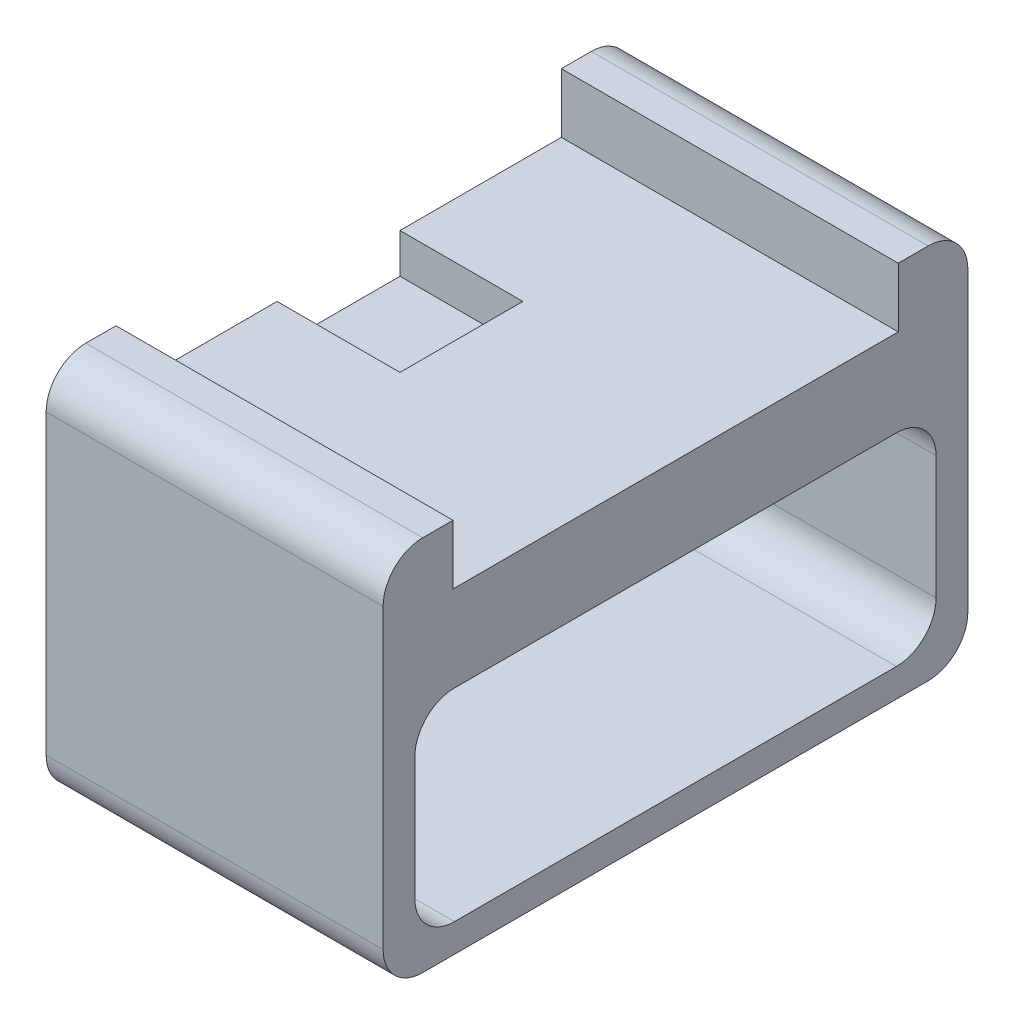
ISO-10303-21;
HEADER;
FILE_DESCRIPTION(('STEP AP214'),'2;1');
FILE_NAME('part.step','',(''),(''),'','','');
FILE_SCHEMA(('AUTOMOTIVE_DESIGN { 1 0 10303 214 1 1 1 1 }'));
ENDSEC;
DATA;
#1=APPLICATION_CONTEXT('core data for automotive mechanical design processes');
#2=APPLICATION_PROTOCOL_DEFINITION('international standard','automotive_design',2000,#1);
#3=PRODUCT_CONTEXT('',#1,'mechanical');
#4=PRODUCT('Part','Part','',(#3));
#5=PRODUCT_RELATED_PRODUCT_CATEGORY('part','',(#4));
#6=PRODUCT_DEFINITION_FORMATION('','',#4);
#7=PRODUCT_DEFINITION_CONTEXT('part definition',#1,'design');
#8=PRODUCT_DEFINITION('design','',#6,#7);
#9=PRODUCT_DEFINITION_SHAPE('','',#8);
#10=(LENGTH_UNIT() NAMED_UNIT(*) SI_UNIT(.MILLI.,.METRE.));
#11=(NAMED_UNIT(*) PLANE_ANGLE_UNIT() SI_UNIT($,.RADIAN.));
#12=(NAMED_UNIT(*) SI_UNIT($,.STERADIAN.) SOLID_ANGLE_UNIT());
#13=UNCERTAINTY_MEASURE_WITH_UNIT(LENGTH_MEASURE(1.E-05),#10,'distance_accuracy_value','');
#14=(GEOMETRIC_REPRESENTATION_CONTEXT(3) GLOBAL_UNCERTAINTY_ASSIGNED_CONTEXT((#13)) GLOBAL_UNIT_ASSIGNED_CONTEXT((#10,
#11,#12)) REPRESENTATION_CONTEXT('',''));
#15=CARTESIAN_POINT('',(0.,0.,0.));
#16=DIRECTION('',(0.,0.,1.));
#17=DIRECTION('',(1.,0.,0.));
#18=AXIS2_PLACEMENT_3D('',#15,#16,#17);
#19=CARTESIAN_POINT('',(21.,9.5,12.75));
#20=DIRECTION('',(0.,-1.,0.));
#21=DIRECTION('',(0.,0.,-1.));
#22=AXIS2_PLACEMENT_3D('',#19,#20,#21);
#23=PLANE('',#22);
#24=DIRECTION('',(0.,0.,1.));
#25=VECTOR('',#24,1.);
#26=CARTESIAN_POINT('',(17.,9.5,12.75));
#27=LINE('',#26,#25);
#28=CARTESIAN_POINT('',(17.,9.5,-12.75));
#29=VERTEX_POINT('',#28);
#30=CARTESIAN_POINT('',(17.,9.5,-11.2400373427258));
#31=VERTEX_POINT('',#30);
#32=EDGE_CURVE('E359',#29,#31,#27,.T.);
#33=ORIENTED_EDGE('',*,*,#32,.F.);
#34=DIRECTION('',(-1.,0.,0.));
#35=VECTOR('',#34,1.);
#36=CARTESIAN_POINT('',(21.,9.5,-12.75));
#37=LINE('',#36,#35);
#38=CARTESIAN_POINT('',(0.,9.5,-12.75));
#39=VERTEX_POINT('',#38);
#40=EDGE_CURVE('E301',#29,#39,#37,.T.);
#41=ORIENTED_EDGE('',*,*,#40,.T.);
#42=DIRECTION('',(0.,0.,1.));
#43=VECTOR('',#42,1.);
#44=CARTESIAN_POINT('',(0.,9.5,12.75));
#45=LINE('',#44,#43);
#46=CARTESIAN_POINT('',(0.,9.5,-11.2400373427258));
#47=VERTEX_POINT('',#46);
#48=EDGE_CURVE('E276',#39,#47,#45,.T.);
#49=ORIENTED_EDGE('',*,*,#48,.T.);
#50=DIRECTION('',(-1.,0.,0.));
#51=VECTOR('',#50,1.);
#52=CARTESIAN_POINT('',(0.,9.5,-11.2400373427258));
#53=LINE('',#52,#51);
#54=EDGE_CURVE('E218',#31,#47,#53,.T.);
#55=ORIENTED_EDGE('',*,*,#54,.F.);
#56=EDGE_LOOP('',(#33,#41,#49,#55));
#57=FACE_BOUND('',#56,.T.);
#58=ADVANCED_FACE('F33',(#57),#23,.F.);
#59=CARTESIAN_POINT('',(21.,-7.5,-12.75));
#60=DIRECTION('',(-1.,0.,0.));
#61=DIRECTION('',(0.,0.,1.));
#62=AXIS2_PLACEMENT_3D('',#59,#60,#61);
#63=CYLINDRICAL_SURFACE('',#62,2.);
#64=CARTESIAN_POINT('',(17.,-7.5,-12.75));
#65=DIRECTION('',(1.,0.,0.));
#66=DIRECTION('',(0.,0.,-1.));
#67=AXIS2_PLACEMENT_3D('',#64,#65,#66);
#68=CIRCLE('',#67,2.);
#69=CARTESIAN_POINT('',(17.,-9.49999999999999,-12.75));
#70=VERTEX_POINT('',#69);
#71=CARTESIAN_POINT('',(17.,-7.5,-14.75));
#72=VERTEX_POINT('',#71);
#73=EDGE_CURVE('E370',#70,#72,#68,.T.);
#74=ORIENTED_EDGE('',*,*,#73,.F.);
#75=DIRECTION('',(-1.,0.,0.));
#76=VECTOR('',#75,1.);
#77=CARTESIAN_POINT('',(21.,-9.5,-12.75));
#78=LINE('',#77,#76);
#79=CARTESIAN_POINT('',(0.,-9.5,-12.75));
#80=VERTEX_POINT('',#79);
#81=EDGE_CURVE('E291',#70,#80,#78,.T.);
#82=ORIENTED_EDGE('',*,*,#81,.T.);
#83=CARTESIAN_POINT('',(0.,-7.5,-12.75));
#84=DIRECTION('',(1.,0.,0.));
#85=DIRECTION('',(0.,0.,1.));
#86=AXIS2_PLACEMENT_3D('',#83,#84,#85);
#87=CIRCLE('',#86,2.);
#88=CARTESIAN_POINT('',(0.,-7.5,-14.75));
#89=VERTEX_POINT('',#88);
#90=EDGE_CURVE('E258',#80,#89,#87,.T.);
#91=ORIENTED_EDGE('',*,*,#90,.T.);
#92=DIRECTION('',(-1.,0.,0.));
#93=VECTOR('',#92,1.);
#94=CARTESIAN_POINT('',(21.,-7.5,-14.75));
#95=LINE('',#94,#93);
#96=EDGE_CURVE('E305',#72,#89,#95,.T.);
#97=ORIENTED_EDGE('',*,*,#96,.F.);
#98=EDGE_LOOP('',(#74,#82,#91,#97));
#99=FACE_BOUND('',#98,.T.);
#100=ADVANCED_FACE('F35',(#99),#63,.T.);
#101=CARTESIAN_POINT('',(21.,-7.5,-14.75));
#102=DIRECTION('',(0.,0.,1.));
#103=DIRECTION('',(0.,-1.,0.));
#104=AXIS2_PLACEMENT_3D('',#101,#102,#103);
#105=PLANE('',#104);
#106=DIRECTION('',(0.,1.,0.));
#107=VECTOR('',#106,1.);
#108=CARTESIAN_POINT('',(17.,-7.5,-14.75));
#109=LINE('',#108,#107);
#110=CARTESIAN_POINT('',(17.,7.5,-14.75));
#111=VERTEX_POINT('',#110);
#112=EDGE_CURVE('E368',#72,#111,#109,.T.);
#113=ORIENTED_EDGE('',*,*,#112,.F.);
#114=ORIENTED_EDGE('',*,*,#96,.T.);
#115=DIRECTION('',(0.,1.,0.));
#116=VECTOR('',#115,1.);
#117=CARTESIAN_POINT('',(0.,-7.5,-14.75));
#118=LINE('',#117,#116);
#119=CARTESIAN_POINT('',(0.,7.5,-14.75));
#120=VERTEX_POINT('',#119);
#121=EDGE_CURVE('E269',#89,#120,#118,.T.);
#122=ORIENTED_EDGE('',*,*,#121,.T.);
#123=DIRECTION('',(-1.,0.,0.));
#124=VECTOR('',#123,1.);
#125=CARTESIAN_POINT('',(21.,7.5,-14.75));
#126=LINE('',#125,#124);
#127=EDGE_CURVE('E303',#111,#120,#126,.T.);
#128=ORIENTED_EDGE('',*,*,#127,.F.);
#129=EDGE_LOOP('',(#113,#114,#122,#128));
#130=FACE_BOUND('',#129,.T.);
#131=ADVANCED_FACE('F443',(#130),#105,.F.);
#132=CARTESIAN_POINT('',(21.,7.5,-12.75));
#133=DIRECTION('',(-1.,0.,0.));
#134=DIRECTION('',(0.,0.,1.));
#135=AXIS2_PLACEMENT_3D('',#132,#133,#134);
#136=CYLINDRICAL_SURFACE('',#135,2.);
#137=CARTESIAN_POINT('',(17.,7.5,-12.75));
#138=DIRECTION('',(1.,0.,0.));
#139=DIRECTION('',(0.,0.,-1.));
#140=AXIS2_PLACEMENT_3D('',#137,#138,#139);
#141=CIRCLE('',#140,2.);
#142=EDGE_CURVE('E366',#111,#29,#141,.T.);
#143=ORIENTED_EDGE('',*,*,#142,.F.);
#144=ORIENTED_EDGE('',*,*,#127,.T.);
#145=CARTESIAN_POINT('',(0.,7.5,-12.75));
#146=DIRECTION('',(1.,0.,0.));
#147=DIRECTION('',(0.,0.,1.));
#148=AXIS2_PLACEMENT_3D('',#145,#146,#147);
#149=CIRCLE('',#148,2.);
#150=EDGE_CURVE('E272',#120,#39,#149,.T.);
#151=ORIENTED_EDGE('',*,*,#150,.T.);
#152=ORIENTED_EDGE('',*,*,#40,.F.);
#153=EDGE_LOOP('',(#143,#144,#151,#152));
#154=FACE_BOUND('',#153,.T.);
#155=ADVANCED_FACE('F450',(#154),#136,.T.);
#156=DIRECTION('',(0.,0.,1.));
#157=VECTOR('',#156,1.);
#158=CARTESIAN_POINT('',(17.,9.5,12.75));
#159=LINE('',#158,#157);
#160=CARTESIAN_POINT('',(17.,9.5,11.2248067322085));
#161=VERTEX_POINT('',#160);
#162=CARTESIAN_POINT('',(17.,9.5,12.75));
#163=VERTEX_POINT('',#162);
#164=EDGE_CURVE('E357',#161,#163,#159,.T.);
#165=ORIENTED_EDGE('',*,*,#164,.F.);
#166=DIRECTION('',(1.,0.,0.));
#167=VECTOR('',#166,1.);
#168=CARTESIAN_POINT('',(0.,9.5,11.2248067322085));
#169=LINE('',#168,#167);
#170=CARTESIAN_POINT('',(0.,9.5,11.2248067322085));
#171=VERTEX_POINT('',#170);
#172=EDGE_CURVE('E204',#171,#161,#169,.T.);
#173=ORIENTED_EDGE('',*,*,#172,.F.);
#174=CARTESIAN_POINT('',(0.,9.5,12.75));
#175=VERTEX_POINT('',#174);
#176=EDGE_CURVE('E275',#171,#175,#45,.T.);
#177=ORIENTED_EDGE('',*,*,#176,.T.);
#178=DIRECTION('',(-1.,0.,0.));
#179=VECTOR('',#178,1.);
#180=CARTESIAN_POINT('',(21.,9.5,12.75));
#181=LINE('',#180,#179);
#182=EDGE_CURVE('E299',#163,#175,#181,.T.);
#183=ORIENTED_EDGE('',*,*,#182,.F.);
#184=EDGE_LOOP('',(#165,#173,#177,#183));
#185=FACE_BOUND('',#184,.T.);
#186=ADVANCED_FACE('F355',(#185),#23,.F.);
#187=CARTESIAN_POINT('',(21.,7.5,12.75));
#188=DIRECTION('',(-1.,0.,0.));
#189=DIRECTION('',(0.,0.,1.));
#190=AXIS2_PLACEMENT_3D('',#187,#188,#189);
#191=CYLINDRICAL_SURFACE('',#190,2.);
#192=CARTESIAN_POINT('',(17.,7.5,12.75));
#193=DIRECTION('',(1.,0.,0.));
#194=DIRECTION('',(0.,0.,-1.));
#195=AXIS2_PLACEMENT_3D('',#192,#193,#194);
#196=CIRCLE('',#195,2.);
#197=CARTESIAN_POINT('',(17.,7.5,14.75));
#198=VERTEX_POINT('',#197);
#199=EDGE_CURVE('E361',#163,#198,#196,.T.);
#200=ORIENTED_EDGE('',*,*,#199,.F.);
#201=ORIENTED_EDGE('',*,*,#182,.T.);
#202=CARTESIAN_POINT('',(0.,7.5,12.75));
#203=DIRECTION('',(1.,0.,0.));
#204=DIRECTION('',(0.,0.,-1.));
#205=AXIS2_PLACEMENT_3D('',#202,#203,#204);
#206=CIRCLE('',#205,2.);
#207=CARTESIAN_POINT('',(0.,7.5,14.75));
#208=VERTEX_POINT('',#207);
#209=EDGE_CURVE('E279',#175,#208,#206,.T.);
#210=ORIENTED_EDGE('',*,*,#209,.T.);
#211=DIRECTION('',(-1.,0.,0.));
#212=VECTOR('',#211,1.);
#213=CARTESIAN_POINT('',(21.,7.5,14.75));
#214=LINE('',#213,#212);
#215=EDGE_CURVE('E297',#198,#208,#214,.T.);
#216=ORIENTED_EDGE('',*,*,#215,.F.);
#217=EDGE_LOOP('',(#200,#201,#210,#216));
#218=FACE_BOUND('',#217,.T.);
#219=ADVANCED_FACE('F449',(#218),#191,.T.);
#220=CARTESIAN_POINT('',(21.,-7.5,14.75));
#221=DIRECTION('',(0.,0.,-1.));
#222=DIRECTION('',(-1.,0.,0.));
#223=AXIS2_PLACEMENT_3D('',#220,#221,#222);
#224=PLANE('',#223);
#225=DIRECTION('',(0.,-1.,0.));
#226=VECTOR('',#225,1.);
#227=CARTESIAN_POINT('',(17.,-7.5,14.75));
#228=LINE('',#227,#226);
#229=CARTESIAN_POINT('',(17.,-7.5,14.75));
#230=VERTEX_POINT('',#229);
#231=EDGE_CURVE('E376',#198,#230,#228,.T.);
#232=ORIENTED_EDGE('',*,*,#231,.F.);
#233=ORIENTED_EDGE('',*,*,#215,.T.);
#234=DIRECTION('',(0.,-1.,0.));
#235=VECTOR('',#234,1.);
#236=CARTESIAN_POINT('',(0.,-7.5,14.75));
#237=LINE('',#236,#235);
#238=CARTESIAN_POINT('',(0.,-7.5,14.75));
#239=VERTEX_POINT('',#238);
#240=EDGE_CURVE('E282',#208,#239,#237,.T.);
#241=ORIENTED_EDGE('',*,*,#240,.T.);
#242=DIRECTION('',(-1.,0.,0.));
#243=VECTOR('',#242,1.);
#244=CARTESIAN_POINT('',(21.,-7.5,14.75));
#245=LINE('',#244,#243);
#246=EDGE_CURVE('E295',#230,#239,#245,.T.);
#247=ORIENTED_EDGE('',*,*,#246,.F.);
#248=EDGE_LOOP('',(#232,#233,#241,#247));
#249=FACE_BOUND('',#248,.T.);
#250=ADVANCED_FACE('F455',(#249),#224,.F.);
#251=CARTESIAN_POINT('',(21.,-7.5,12.75));
#252=DIRECTION('',(-1.,0.,0.));
#253=DIRECTION('',(0.,0.,1.));
#254=AXIS2_PLACEMENT_3D('',#251,#252,#253);
#255=CYLINDRICAL_SURFACE('',#254,2.);
#256=CARTESIAN_POINT('',(17.,-7.5,12.75));
#257=DIRECTION('',(1.,0.,0.));
#258=DIRECTION('',(0.,0.,-1.));
#259=AXIS2_PLACEMENT_3D('',#256,#257,#258);
#260=CIRCLE('',#259,2.);
#261=CARTESIAN_POINT('',(17.,-9.5,12.75));
#262=VERTEX_POINT('',#261);
#263=EDGE_CURVE('E374',#230,#262,#260,.T.);
#264=ORIENTED_EDGE('',*,*,#263,.F.);
#265=ORIENTED_EDGE('',*,*,#246,.T.);
#266=CARTESIAN_POINT('',(0.,-7.5,12.75));
#267=DIRECTION('',(1.,0.,0.));
#268=DIRECTION('',(0.,0.,-1.));
#269=AXIS2_PLACEMENT_3D('',#266,#267,#268);
#270=CIRCLE('',#269,2.);
#271=CARTESIAN_POINT('',(0.,-9.5,12.75));
#272=VERTEX_POINT('',#271);
#273=EDGE_CURVE('E285',#239,#272,#270,.T.);
#274=ORIENTED_EDGE('',*,*,#273,.T.);
#275=DIRECTION('',(-1.,0.,0.));
#276=VECTOR('',#275,1.);
#277=CARTESIAN_POINT('',(21.,-9.5,12.75));
#278=LINE('',#277,#276);
#279=EDGE_CURVE('E293',#262,#272,#278,.T.);
#280=ORIENTED_EDGE('',*,*,#279,.F.);
#281=EDGE_LOOP('',(#264,#265,#274,#280));
#282=FACE_BOUND('',#281,.T.);
#283=ADVANCED_FACE('F506',(#282),#255,.T.);
#284=CARTESIAN_POINT('',(21.,-9.5,12.75));
#285=DIRECTION('',(0.,1.,0.));
#286=DIRECTION('',(0.,0.,1.));
#287=AXIS2_PLACEMENT_3D('',#284,#285,#286);
#288=PLANE('',#287);
#289=DIRECTION('',(0.,0.,-1.));
#290=VECTOR('',#289,1.);
#291=CARTESIAN_POINT('',(17.,-9.5,12.75));
#292=LINE('',#291,#290);
#293=EDGE_CURVE('E372',#262,#70,#292,.T.);
#294=ORIENTED_EDGE('',*,*,#293,.F.);
#295=ORIENTED_EDGE('',*,*,#279,.T.);
#296=DIRECTION('',(0.,0.,-1.));
#297=VECTOR('',#296,1.);
#298=CARTESIAN_POINT('',(0.,-9.5,12.75));
#299=LINE('',#298,#297);
#300=EDGE_CURVE('E288',#272,#80,#299,.T.);
#301=ORIENTED_EDGE('',*,*,#300,.T.);
#302=ORIENTED_EDGE('',*,*,#81,.F.);
#303=EDGE_LOOP('',(#294,#295,#301,#302));
#304=FACE_BOUND('',#303,.T.);
#305=ADVANCED_FACE('F503',(#304),#288,.F.);
#306=CARTESIAN_POINT('',(21.,-6.07292875406995,11.147623692795));
#307=DIRECTION('',(-1.,0.,0.));
#308=DIRECTION('',(0.,0.,1.));
#309=AXIS2_PLACEMENT_3D('',#306,#307,#308);
#310=CYLINDRICAL_SURFACE('',#309,2.);
#311=CARTESIAN_POINT('',(17.,-6.07292875406995,11.147623692795));
#312=DIRECTION('',(1.,0.,0.));
#313=DIRECTION('',(0.,0.,-1.));
#314=AXIS2_PLACEMENT_3D('',#311,#312,#313);
#315=CIRCLE('',#314,2.);
#316=CARTESIAN_POINT('',(17.,-8.07292875406995,11.147623692795));
#317=VERTEX_POINT('',#316);
#318=CARTESIAN_POINT('',(17.,-6.07292875406995,13.147623692795));
#319=VERTEX_POINT('',#318);
#320=EDGE_CURVE('E48',#317,#319,#315,.F.);
#321=ORIENTED_EDGE('',*,*,#320,.F.);
#322=DIRECTION('',(-1.,0.,0.));
#323=VECTOR('',#322,1.);
#324=CARTESIAN_POINT('',(21.,-8.07292875406995,11.147623692795));
#325=LINE('',#324,#323);
#326=CARTESIAN_POINT('',(0.,-8.07292875406995,11.147623692795));
#327=VERTEX_POINT('',#326);
#328=EDGE_CURVE('E231',#317,#327,#325,.T.);
#329=ORIENTED_EDGE('',*,*,#328,.T.);
#330=CARTESIAN_POINT('',(0.,-6.07292875406995,11.147623692795));
#331=DIRECTION('',(-1.,0.,0.));
#332=DIRECTION('',(0.,0.,1.));
#333=AXIS2_PLACEMENT_3D('',#330,#331,#332);
#334=CIRCLE('',#333,2.);
#335=CARTESIAN_POINT('',(0.,-6.07292875406995,13.147623692795));
#336=VERTEX_POINT('',#335);
#337=EDGE_CURVE('E328',#327,#336,#334,.T.);
#338=ORIENTED_EDGE('',*,*,#337,.T.);
#339=DIRECTION('',(-1.,0.,0.));
#340=VECTOR('',#339,1.);
#341=CARTESIAN_POINT('',(21.,-6.07292875406995,13.147623692795));
#342=LINE('',#341,#340);
#343=EDGE_CURVE('E228',#319,#336,#342,.T.);
#344=ORIENTED_EDGE('',*,*,#343,.F.);
#345=EDGE_LOOP('',(#321,#329,#338,#344));
#346=FACE_BOUND('',#345,.T.);
#347=ADVANCED_FACE('F398',(#346),#310,.F.);
#348=CARTESIAN_POINT('',(21.,-8.07292875406995,-11.147623692795));
#349=DIRECTION('',(0.,-1.,0.));
#350=DIRECTION('',(0.,0.,-1.));
#351=AXIS2_PLACEMENT_3D('',#348,#349,#350);
#352=PLANE('',#351);
#353=DIRECTION('',(0.,0.,1.));
#354=VECTOR('',#353,1.);
#355=CARTESIAN_POINT('',(17.,-8.07292875406995,-11.147623692795));
#356=LINE('',#355,#354);
#357=CARTESIAN_POINT('',(17.,-8.07292875406995,-11.147623692795));
#358=VERTEX_POINT('',#357);
#359=EDGE_CURVE('E390',#358,#317,#356,.T.);
#360=ORIENTED_EDGE('',*,*,#359,.F.);
#361=DIRECTION('',(-1.,0.,0.));
#362=VECTOR('',#361,1.);
#363=CARTESIAN_POINT('',(21.,-8.07292875406995,-11.147623692795));
#364=LINE('',#363,#362);
#365=CARTESIAN_POINT('',(0.,-8.07292875406995,-11.147623692795));
#366=VERTEX_POINT('',#365);
#367=EDGE_CURVE('E229',#358,#366,#364,.T.);
#368=ORIENTED_EDGE('',*,*,#367,.T.);
#369=DIRECTION('',(0.,0.,-1.));
#370=VECTOR('',#369,1.);
#371=CARTESIAN_POINT('',(0.,-8.07292875406995,-11.147623692795));
#372=LINE('',#371,#370);
#373=EDGE_CURVE('E325',#366,#327,#372,.F.);
#374=ORIENTED_EDGE('',*,*,#373,.T.);
#375=ORIENTED_EDGE('',*,*,#328,.F.);
#376=EDGE_LOOP('',(#360,#368,#374,#375));
#377=FACE_BOUND('',#376,.T.);
#378=ADVANCED_FACE('F399',(#377),#352,.F.);
#379=CARTESIAN_POINT('',(21.,-6.07292875406995,-11.147623692795));
#380=DIRECTION('',(-1.,0.,0.));
#381=DIRECTION('',(0.,0.,1.));
#382=AXIS2_PLACEMENT_3D('',#379,#380,#381);
#383=CYLINDRICAL_SURFACE('',#382,2.);
#384=CARTESIAN_POINT('',(17.,-6.07292875406995,-11.147623692795));
#385=DIRECTION('',(1.,0.,0.));
#386=DIRECTION('',(0.,0.,-1.));
#387=AXIS2_PLACEMENT_3D('',#384,#385,#386);
#388=CIRCLE('',#387,2.);
#389=CARTESIAN_POINT('',(17.,-6.07292875406995,-13.147623692795));
#390=VERTEX_POINT('',#389);
#391=EDGE_CURVE('E388',#390,#358,#388,.F.);
#392=ORIENTED_EDGE('',*,*,#391,.F.);
#393=DIRECTION('',(-1.,0.,0.));
#394=VECTOR('',#393,1.);
#395=CARTESIAN_POINT('',(21.,-6.07292875406995,-13.147623692795));
#396=LINE('',#395,#394);
#397=CARTESIAN_POINT('',(0.,-6.07292875406995,-13.147623692795));
#398=VERTEX_POINT('',#397);
#399=EDGE_CURVE('E232',#390,#398,#396,.T.);
#400=ORIENTED_EDGE('',*,*,#399,.T.);
#401=CARTESIAN_POINT('',(0.,-6.07292875406995,-11.147623692795));
#402=DIRECTION('',(-1.,0.,0.));
#403=DIRECTION('',(0.,0.,1.));
#404=AXIS2_PLACEMENT_3D('',#401,#402,#403);
#405=CIRCLE('',#404,2.);
#406=EDGE_CURVE('E322',#398,#366,#405,.T.);
#407=ORIENTED_EDGE('',*,*,#406,.T.);
#408=ORIENTED_EDGE('',*,*,#367,.F.);
#409=EDGE_LOOP('',(#392,#400,#407,#408));
#410=FACE_BOUND('',#409,.T.);
#411=ADVANCED_FACE('F428',(#410),#383,.F.);
#412=CARTESIAN_POINT('',(21.,-6.07292875406995,-13.147623692795));
#413=DIRECTION('',(0.,0.,-1.));
#414=DIRECTION('',(-1.,0.,0.));
#415=AXIS2_PLACEMENT_3D('',#412,#413,#414);
#416=PLANE('',#415);
#417=DIRECTION('',(0.,-1.,0.));
#418=VECTOR('',#417,1.);
#419=CARTESIAN_POINT('',(17.,-6.07292875406995,-13.147623692795));
#420=LINE('',#419,#418);
#421=CARTESIAN_POINT('',(17.,0.135263403800991,-13.147623692795));
#422=VERTEX_POINT('',#421);
#423=EDGE_CURVE('E386',#422,#390,#420,.T.);
#424=ORIENTED_EDGE('',*,*,#423,.F.);
#425=DIRECTION('',(-1.,0.,0.));
#426=VECTOR('',#425,1.);
#427=CARTESIAN_POINT('',(21.,0.135263403800991,-13.147623692795));
#428=LINE('',#427,#426);
#429=CARTESIAN_POINT('',(0.,0.135263403800991,-13.147623692795));
#430=VERTEX_POINT('',#429);
#431=EDGE_CURVE('E238',#422,#430,#428,.T.);
#432=ORIENTED_EDGE('',*,*,#431,.T.);
#433=DIRECTION('',(0.,1.,0.));
#434=VECTOR('',#433,1.);
#435=CARTESIAN_POINT('',(0.,-6.07292875406995,-13.147623692795));
#436=LINE('',#435,#434);
#437=EDGE_CURVE('E319',#430,#398,#436,.F.);
#438=ORIENTED_EDGE('',*,*,#437,.T.);
#439=ORIENTED_EDGE('',*,*,#399,.F.);
#440=EDGE_LOOP('',(#424,#432,#438,#439));
#441=FACE_BOUND('',#440,.T.);
#442=ADVANCED_FACE('F425',(#441),#416,.F.);
#443=CARTESIAN_POINT('',(21.,0.135263403800991,-11.147623692795));
#444=DIRECTION('',(-1.,0.,0.));
#445=DIRECTION('',(0.,0.,1.));
#446=AXIS2_PLACEMENT_3D('',#443,#444,#445);
#447=CYLINDRICAL_SURFACE('',#446,2.);
#448=CARTESIAN_POINT('',(17.,0.135263403800991,-11.147623692795));
#449=DIRECTION('',(1.,0.,0.));
#450=DIRECTION('',(0.,0.,-1.));
#451=AXIS2_PLACEMENT_3D('',#448,#449,#450);
#452=CIRCLE('',#451,2.);
#453=CARTESIAN_POINT('',(17.,2.13526340380099,-11.147623692795));
#454=VERTEX_POINT('',#453);
#455=EDGE_CURVE('E384',#454,#422,#452,.F.);
#456=ORIENTED_EDGE('',*,*,#455,.F.);
#457=DIRECTION('',(-1.,0.,0.));
#458=VECTOR('',#457,1.);
#459=CARTESIAN_POINT('',(21.,2.13526340380099,-11.147623692795));
#460=LINE('',#459,#458);
#461=CARTESIAN_POINT('',(0.,2.13526340380099,-11.147623692795));
#462=VERTEX_POINT('',#461);
#463=EDGE_CURVE('E240',#454,#462,#460,.T.);
#464=ORIENTED_EDGE('',*,*,#463,.T.);
#465=CARTESIAN_POINT('',(0.,0.135263403800991,-11.147623692795));
#466=DIRECTION('',(-1.,0.,0.));
#467=DIRECTION('',(0.,0.,1.));
#468=AXIS2_PLACEMENT_3D('',#465,#466,#467);
#469=CIRCLE('',#468,2.);
#470=EDGE_CURVE('E316',#462,#430,#469,.T.);
#471=ORIENTED_EDGE('',*,*,#470,.T.);
#472=ORIENTED_EDGE('',*,*,#431,.F.);
#473=EDGE_LOOP('',(#456,#464,#471,#472));
#474=FACE_BOUND('',#473,.T.);
#475=ADVANCED_FACE('F422',(#474),#447,.F.);
#476=CARTESIAN_POINT('',(21.,2.13526340380099,-11.147623692795));
#477=DIRECTION('',(0.,1.,0.));
#478=DIRECTION('',(0.,0.,1.));
#479=AXIS2_PLACEMENT_3D('',#476,#477,#478);
#480=PLANE('',#479);
#481=DIRECTION('',(0.,0.,-1.));
#482=VECTOR('',#481,1.);
#483=CARTESIAN_POINT('',(17.,2.13526340380099,-11.147623692795));
#484=LINE('',#483,#482);
#485=CARTESIAN_POINT('',(17.,2.13526340380099,11.147623692795));
#486=VERTEX_POINT('',#485);
#487=EDGE_CURVE('E382',#486,#454,#484,.T.);
#488=ORIENTED_EDGE('',*,*,#487,.F.);
#489=DIRECTION('',(-1.,0.,0.));
#490=VECTOR('',#489,1.);
#491=CARTESIAN_POINT('',(21.,2.13526340380099,11.147623692795));
#492=LINE('',#491,#490);
#493=CARTESIAN_POINT('',(0.,2.13526340380099,11.147623692795));
#494=VERTEX_POINT('',#493);
#495=EDGE_CURVE('E242',#486,#494,#492,.T.);
#496=ORIENTED_EDGE('',*,*,#495,.T.);
#497=DIRECTION('',(0.,0.,1.));
#498=VECTOR('',#497,1.);
#499=CARTESIAN_POINT('',(0.,2.13526340380099,-11.147623692795));
#500=LINE('',#499,#498);
#501=EDGE_CURVE('E313',#494,#462,#500,.F.);
#502=ORIENTED_EDGE('',*,*,#501,.T.);
#503=ORIENTED_EDGE('',*,*,#463,.F.);
#504=EDGE_LOOP('',(#488,#496,#502,#503));
#505=FACE_BOUND('',#504,.T.);
#506=ADVANCED_FACE('F415',(#505),#480,.F.);
#507=CARTESIAN_POINT('',(21.,0.135263403800991,11.147623692795));
#508=DIRECTION('',(-1.,0.,0.));
#509=DIRECTION('',(0.,0.,1.));
#510=AXIS2_PLACEMENT_3D('',#507,#508,#509);
#511=CYLINDRICAL_SURFACE('',#510,2.);
#512=CARTESIAN_POINT('',(17.,0.135263403800991,11.147623692795));
#513=DIRECTION('',(1.,0.,0.));
#514=DIRECTION('',(0.,0.,-1.));
#515=AXIS2_PLACEMENT_3D('',#512,#513,#514);
#516=CIRCLE('',#515,2.);
#517=CARTESIAN_POINT('',(17.,0.135263403800992,13.147623692795));
#518=VERTEX_POINT('',#517);
#519=EDGE_CURVE('E380',#518,#486,#516,.F.);
#520=ORIENTED_EDGE('',*,*,#519,.F.);
#521=DIRECTION('',(-1.,0.,0.));
#522=VECTOR('',#521,1.);
#523=CARTESIAN_POINT('',(21.,0.135263403800991,13.147623692795));
#524=LINE('',#523,#522);
#525=CARTESIAN_POINT('',(0.,0.135263403800991,13.147623692795));
#526=VERTEX_POINT('',#525);
#527=EDGE_CURVE('E236',#518,#526,#524,.T.);
#528=ORIENTED_EDGE('',*,*,#527,.T.);
#529=CARTESIAN_POINT('',(0.,0.135263403800991,11.147623692795));
#530=DIRECTION('',(-1.,0.,0.));
#531=DIRECTION('',(0.,0.,1.));
#532=AXIS2_PLACEMENT_3D('',#529,#530,#531);
#533=CIRCLE('',#532,2.);
#534=EDGE_CURVE('E310',#526,#494,#533,.T.);
#535=ORIENTED_EDGE('',*,*,#534,.T.);
#536=ORIENTED_EDGE('',*,*,#495,.F.);
#537=EDGE_LOOP('',(#520,#528,#535,#536));
#538=FACE_BOUND('',#537,.T.);
#539=ADVANCED_FACE('F413',(#538),#511,.F.);
#540=CARTESIAN_POINT('',(21.,-6.07292875406995,13.147623692795));
#541=DIRECTION('',(0.,0.,1.));
#542=DIRECTION('',(1.,0.,0.));
#543=AXIS2_PLACEMENT_3D('',#540,#541,#542);
#544=PLANE('',#543);
#545=DIRECTION('',(0.,1.,0.));
#546=VECTOR('',#545,1.);
#547=CARTESIAN_POINT('',(17.,-6.07292875406995,13.147623692795));
#548=LINE('',#547,#546);
#549=EDGE_CURVE('E378',#319,#518,#548,.T.);
#550=ORIENTED_EDGE('',*,*,#549,.F.);
#551=ORIENTED_EDGE('',*,*,#343,.T.);
#552=DIRECTION('',(0.,1.,0.));
#553=VECTOR('',#552,1.);
#554=CARTESIAN_POINT('',(0.,-6.07292875406995,13.147623692795));
#555=LINE('',#554,#553);
#556=EDGE_CURVE('E307',#336,#526,#555,.T.);
#557=ORIENTED_EDGE('',*,*,#556,.T.);
#558=ORIENTED_EDGE('',*,*,#527,.F.);
#559=EDGE_LOOP('',(#550,#551,#557,#558));
#560=FACE_BOUND('',#559,.T.);
#561=ADVANCED_FACE('F408',(#560),#544,.F.);
#562=CARTESIAN_POINT('',(0.,6.5,-11.2400373427258));
#563=DIRECTION('',(0.,0.,-1.));
#564=DIRECTION('',(-1.,0.,0.));
#565=AXIS2_PLACEMENT_3D('',#562,#563,#564);
#566=PLANE('',#565);
#567=DIRECTION('',(0.,-1.,0.));
#568=VECTOR('',#567,1.);
#569=CARTESIAN_POINT('',(17.,6.5,-11.2400373427258));
#570=LINE('',#569,#568);
#571=CARTESIAN_POINT('',(17.,6.5,-11.2400373427258));
#572=VERTEX_POINT('',#571);
#573=EDGE_CURVE('E56',#31,#572,#570,.T.);
#574=ORIENTED_EDGE('',*,*,#573,.F.);
#575=ORIENTED_EDGE('',*,*,#54,.T.);
#576=DIRECTION('',(0.,1.,0.));
#577=VECTOR('',#576,1.);
#578=CARTESIAN_POINT('',(0.,6.5,-11.2400373427258));
#579=LINE('',#578,#577);
#580=CARTESIAN_POINT('',(0.,6.5,-11.2400373427258));
#581=VERTEX_POINT('',#580);
#582=EDGE_CURVE('E220',#581,#47,#579,.T.);
#583=ORIENTED_EDGE('',*,*,#582,.F.);
#584=DIRECTION('',(-1.,0.,0.));
#585=VECTOR('',#584,1.);
#586=CARTESIAN_POINT('',(0.,6.5,-11.2400373427258));
#587=LINE('',#586,#585);
#588=EDGE_CURVE('E209',#572,#581,#587,.T.);
#589=ORIENTED_EDGE('',*,*,#588,.F.);
#590=EDGE_LOOP('',(#574,#575,#583,#589));
#591=FACE_BOUND('',#590,.T.);
#592=ADVANCED_FACE('F474',(#591),#566,.F.);
#593=CARTESIAN_POINT('',(0.,6.5,11.2248067322085));
#594=DIRECTION('',(0.,0.,1.));
#595=DIRECTION('',(0.,-1.,0.));
#596=AXIS2_PLACEMENT_3D('',#593,#594,#595);
#597=PLANE('',#596);
#598=DIRECTION('',(0.,1.,0.));
#599=VECTOR('',#598,1.);
#600=CARTESIAN_POINT('',(17.,6.5,11.2248067322085));
#601=LINE('',#600,#599);
#602=CARTESIAN_POINT('',(17.,6.5,11.2248067322085));
#603=VERTEX_POINT('',#602);
#604=EDGE_CURVE('E192',#603,#161,#601,.T.);
#605=ORIENTED_EDGE('',*,*,#604,.F.);
#606=DIRECTION('',(1.,0.,0.));
#607=VECTOR('',#606,1.);
#608=CARTESIAN_POINT('',(0.,6.5,11.2248067322085));
#609=LINE('',#608,#607);
#610=CARTESIAN_POINT('',(0.,6.5,11.2248067322085));
#611=VERTEX_POINT('',#610);
#612=EDGE_CURVE('E201',#611,#603,#609,.T.);
#613=ORIENTED_EDGE('',*,*,#612,.F.);
#614=DIRECTION('',(0.,1.,0.));
#615=VECTOR('',#614,1.);
#616=CARTESIAN_POINT('',(0.,6.5,11.2248067322085));
#617=LINE('',#616,#615);
#618=EDGE_CURVE('E212',#611,#171,#617,.T.);
#619=ORIENTED_EDGE('',*,*,#618,.T.);
#620=ORIENTED_EDGE('',*,*,#172,.T.);
#621=EDGE_LOOP('',(#605,#613,#619,#620));
#622=FACE_BOUND('',#621,.T.);
#623=ADVANCED_FACE('F200',(#622),#597,.F.);
#624=CARTESIAN_POINT('',(0.,6.5,0.));
#625=DIRECTION('',(0.,1.,0.));
#626=DIRECTION('',(0.,0.,1.));
#627=AXIS2_PLACEMENT_3D('',#624,#625,#626);
#628=PLANE('',#627);
#629=ORIENTED_EDGE('',*,*,#612,.T.);
#630=DIRECTION('',(0.,0.,-1.));
#631=VECTOR('',#630,1.);
#632=CARTESIAN_POINT('',(17.,6.5,0.));
#633=LINE('',#632,#631);
#634=EDGE_CURVE('E11',#603,#572,#633,.T.);
#635=ORIENTED_EDGE('',*,*,#634,.T.);
#636=ORIENTED_EDGE('',*,*,#588,.T.);
#637=DIRECTION('',(0.,0.,1.));
#638=VECTOR('',#637,1.);
#639=CARTESIAN_POINT('',(0.,6.5,-11.2400373427258));
#640=LINE('',#639,#638);
#641=CARTESIAN_POINT('',(0.,6.5,-3.1));
#642=VERTEX_POINT('',#641);
#643=EDGE_CURVE('E210',#581,#642,#640,.T.);
#644=ORIENTED_EDGE('',*,*,#643,.T.);
#645=DIRECTION('',(1.,0.,0.));
#646=VECTOR('',#645,1.);
#647=CARTESIAN_POINT('',(6.2,6.5,-3.1));
#648=LINE('',#647,#646);
#649=CARTESIAN_POINT('',(6.2,6.5,-3.1));
#650=VERTEX_POINT('',#649);
#651=EDGE_CURVE('E41',#642,#650,#648,.T.);
#652=ORIENTED_EDGE('',*,*,#651,.T.);
#653=DIRECTION('',(0.,0.,1.));
#654=VECTOR('',#653,1.);
#655=CARTESIAN_POINT('',(6.2,6.5,-3.1));
#656=LINE('',#655,#654);
#657=CARTESIAN_POINT('',(6.2,6.5,3.1));
#658=VERTEX_POINT('',#657);
#659=EDGE_CURVE('E223',#650,#658,#656,.T.);
#660=ORIENTED_EDGE('',*,*,#659,.T.);
#661=DIRECTION('',(-1.,0.,0.));
#662=VECTOR('',#661,1.);
#663=CARTESIAN_POINT('',(6.2,6.5,3.1));
#664=LINE('',#663,#662);
#665=CARTESIAN_POINT('',(0.,6.5,3.1));
#666=VERTEX_POINT('',#665);
#667=EDGE_CURVE('E226',#658,#666,#664,.T.);
#668=ORIENTED_EDGE('',*,*,#667,.T.);
#669=EDGE_CURVE('E208',#666,#611,#640,.T.);
#670=ORIENTED_EDGE('',*,*,#669,.T.);
#671=EDGE_LOOP('',(#629,#635,#636,#644,#652,#660,#668,#670));
#672=FACE_BOUND('',#671,.T.);
#673=ADVANCED_FACE('F206',(#672),#628,.T.);
#674=CARTESIAN_POINT('',(6.2,4.5,-3.1));
#675=DIRECTION('',(1.,0.,0.));
#676=DIRECTION('',(0.,0.,-1.));
#677=AXIS2_PLACEMENT_3D('',#674,#675,#676);
#678=PLANE('',#677);
#679=ORIENTED_EDGE('',*,*,#659,.F.);
#680=DIRECTION('',(0.,1.,0.));
#681=VECTOR('',#680,1.);
#682=CARTESIAN_POINT('',(6.2,4.5,-3.1));
#683=LINE('',#682,#681);
#684=CARTESIAN_POINT('',(6.2,4.5,-3.1));
#685=VERTEX_POINT('',#684);
#686=EDGE_CURVE('E254',#685,#650,#683,.T.);
#687=ORIENTED_EDGE('',*,*,#686,.F.);
#688=DIRECTION('',(0.,0.,-1.));
#689=VECTOR('',#688,1.);
#690=CARTESIAN_POINT('',(6.2,4.5,-3.1));
#691=LINE('',#690,#689);
#692=CARTESIAN_POINT('',(6.2,4.5,3.1));
#693=VERTEX_POINT('',#692);
#694=EDGE_CURVE('E234',#693,#685,#691,.T.);
#695=ORIENTED_EDGE('',*,*,#694,.F.);
#696=DIRECTION('',(0.,1.,0.));
#697=VECTOR('',#696,1.);
#698=CARTESIAN_POINT('',(6.2,4.5,3.1));
#699=LINE('',#698,#697);
#700=EDGE_CURVE('E255',#693,#658,#699,.T.);
#701=ORIENTED_EDGE('',*,*,#700,.T.);
#702=EDGE_LOOP('',(#679,#687,#695,#701));
#703=FACE_BOUND('',#702,.T.);
#704=ADVANCED_FACE('F337',(#703),#678,.F.);
#705=CARTESIAN_POINT('',(6.2,4.5,3.1));
#706=DIRECTION('',(0.,0.,1.));
#707=DIRECTION('',(1.,0.,0.));
#708=AXIS2_PLACEMENT_3D('',#705,#706,#707);
#709=PLANE('',#708);
#710=ORIENTED_EDGE('',*,*,#667,.F.);
#711=ORIENTED_EDGE('',*,*,#700,.F.);
#712=DIRECTION('',(1.,0.,0.));
#713=VECTOR('',#712,1.);
#714=CARTESIAN_POINT('',(6.2,4.5,3.1));
#715=LINE('',#714,#713);
#716=CARTESIAN_POINT('',(0.,4.5,3.1));
#717=VERTEX_POINT('',#716);
#718=EDGE_CURVE('E251',#717,#693,#715,.T.);
#719=ORIENTED_EDGE('',*,*,#718,.F.);
#720=DIRECTION('',(0.,1.,0.));
#721=VECTOR('',#720,1.);
#722=CARTESIAN_POINT('',(0.,4.5,3.1));
#723=LINE('',#722,#721);
#724=EDGE_CURVE('E259',#717,#666,#723,.T.);
#725=ORIENTED_EDGE('',*,*,#724,.T.);
#726=EDGE_LOOP('',(#710,#711,#719,#725));
#727=FACE_BOUND('',#726,.T.);
#728=ADVANCED_FACE('F347',(#727),#709,.F.);
#729=CARTESIAN_POINT('',(6.2,4.5,-3.1));
#730=DIRECTION('',(0.,0.,-1.));
#731=DIRECTION('',(-1.,0.,0.));
#732=AXIS2_PLACEMENT_3D('',#729,#730,#731);
#733=PLANE('',#732);
#734=ORIENTED_EDGE('',*,*,#651,.F.);
#735=DIRECTION('',(0.,1.,0.));
#736=VECTOR('',#735,1.);
#737=CARTESIAN_POINT('',(0.,4.5,-3.1));
#738=LINE('',#737,#736);
#739=CARTESIAN_POINT('',(0.,4.5,-3.1));
#740=VERTEX_POINT('',#739);
#741=EDGE_CURVE('E262',#740,#642,#738,.T.);
#742=ORIENTED_EDGE('',*,*,#741,.F.);
#743=DIRECTION('',(-1.,0.,0.));
#744=VECTOR('',#743,1.);
#745=CARTESIAN_POINT('',(6.2,4.5,-3.1));
#746=LINE('',#745,#744);
#747=EDGE_CURVE('E247',#685,#740,#746,.T.);
#748=ORIENTED_EDGE('',*,*,#747,.F.);
#749=ORIENTED_EDGE('',*,*,#686,.T.);
#750=EDGE_LOOP('',(#734,#742,#748,#749));
#751=FACE_BOUND('',#750,.T.);
#752=ADVANCED_FACE('F340',(#751),#733,.F.);
#753=CARTESIAN_POINT('',(0.,-7.5,-12.75));
#754=DIRECTION('',(-1.,0.,0.));
#755=DIRECTION('',(0.,0.,1.));
#756=AXIS2_PLACEMENT_3D('',#753,#754,#755);
#757=PLANE('',#756);
#758=ORIENTED_EDGE('',*,*,#618,.F.);
#759=ORIENTED_EDGE('',*,*,#669,.F.);
#760=ORIENTED_EDGE('',*,*,#724,.F.);
#761=DIRECTION('',(0.,0.,1.));
#762=VECTOR('',#761,1.);
#763=CARTESIAN_POINT('',(0.,4.5,-3.1));
#764=LINE('',#763,#762);
#765=EDGE_CURVE('E249',#740,#717,#764,.T.);
#766=ORIENTED_EDGE('',*,*,#765,.F.);
#767=ORIENTED_EDGE('',*,*,#741,.T.);
#768=ORIENTED_EDGE('',*,*,#643,.F.);
#769=ORIENTED_EDGE('',*,*,#582,.T.);
#770=ORIENTED_EDGE('',*,*,#48,.F.);
#771=ORIENTED_EDGE('',*,*,#150,.F.);
#772=ORIENTED_EDGE('',*,*,#121,.F.);
#773=ORIENTED_EDGE('',*,*,#90,.F.);
#774=ORIENTED_EDGE('',*,*,#300,.F.);
#775=ORIENTED_EDGE('',*,*,#273,.F.);
#776=ORIENTED_EDGE('',*,*,#240,.F.);
#777=ORIENTED_EDGE('',*,*,#209,.F.);
#778=ORIENTED_EDGE('',*,*,#176,.F.);
#779=EDGE_LOOP('',(#758,#759,#760,#766,#767,#768,#769,#770,#771,#772,#773,#774,#775,#776,#777,#778));
#780=FACE_BOUND('',#779,.T.);
#781=ORIENTED_EDGE('',*,*,#337,.F.);
#782=ORIENTED_EDGE('',*,*,#373,.F.);
#783=ORIENTED_EDGE('',*,*,#406,.F.);
#784=ORIENTED_EDGE('',*,*,#437,.F.);
#785=ORIENTED_EDGE('',*,*,#470,.F.);
#786=ORIENTED_EDGE('',*,*,#501,.F.);
#787=ORIENTED_EDGE('',*,*,#534,.F.);
#788=ORIENTED_EDGE('',*,*,#556,.F.);
#789=EDGE_LOOP('',(#781,#782,#783,#784,#785,#786,#787,#788));
#790=FACE_BOUND('',#789,.T.);
#791=ADVANCED_FACE('F349',(#780,#790),#757,.T.);
#792=CARTESIAN_POINT('',(0.,4.5,0.));
#793=DIRECTION('',(0.,-1.,0.));
#794=DIRECTION('',(0.,0.,-1.));
#795=AXIS2_PLACEMENT_3D('',#792,#793,#794);
#796=PLANE('',#795);
#797=ORIENTED_EDGE('',*,*,#694,.T.);
#798=ORIENTED_EDGE('',*,*,#747,.T.);
#799=ORIENTED_EDGE('',*,*,#765,.T.);
#800=ORIENTED_EDGE('',*,*,#718,.T.);
#801=EDGE_LOOP('',(#797,#798,#799,#800));
#802=FACE_BOUND('',#801,.T.);
#803=ADVANCED_FACE('F343',(#802),#796,.F.);
#804=CARTESIAN_POINT('',(17.,0.,0.));
#805=DIRECTION('',(1.,0.,0.));
#806=DIRECTION('',(0.,0.,-1.));
#807=AXIS2_PLACEMENT_3D('',#804,#805,#806);
#808=PLANE('',#807);
#809=ORIENTED_EDGE('',*,*,#231,.T.);
#810=ORIENTED_EDGE('',*,*,#263,.T.);
#811=ORIENTED_EDGE('',*,*,#293,.T.);
#812=ORIENTED_EDGE('',*,*,#73,.T.);
#813=ORIENTED_EDGE('',*,*,#112,.T.);
#814=ORIENTED_EDGE('',*,*,#142,.T.);
#815=ORIENTED_EDGE('',*,*,#32,.T.);
#816=ORIENTED_EDGE('',*,*,#573,.T.);
#817=ORIENTED_EDGE('',*,*,#634,.F.);
#818=ORIENTED_EDGE('',*,*,#604,.T.);
#819=ORIENTED_EDGE('',*,*,#164,.T.);
#820=ORIENTED_EDGE('',*,*,#199,.T.);
#821=EDGE_LOOP('',(#809,#810,#811,#812,#813,#814,#815,#816,#817,#818,#819,#820));
#822=FACE_BOUND('',#821,.T.);
#823=ORIENTED_EDGE('',*,*,#320,.T.);
#824=ORIENTED_EDGE('',*,*,#549,.T.);
#825=ORIENTED_EDGE('',*,*,#519,.T.);
#826=ORIENTED_EDGE('',*,*,#487,.T.);
#827=ORIENTED_EDGE('',*,*,#455,.T.);
#828=ORIENTED_EDGE('',*,*,#423,.T.);
#829=ORIENTED_EDGE('',*,*,#391,.T.);
#830=ORIENTED_EDGE('',*,*,#359,.T.);
#831=EDGE_LOOP('',(#823,#824,#825,#826,#827,#828,#829,#830));
#832=FACE_BOUND('',#831,.T.);
#833=ADVANCED_FACE('F191',(#822,#832),#808,.T.);
#834=CLOSED_SHELL('',(#58,#100,#131,#155,#186,#219,#250,#283,#305,#347,#378,#411,#442,#475,#506,
#539,#561,#592,#623,#673,#704,#728,#752,#791,#803,#833));
#835=MANIFOLD_SOLID_BREP('B2',#834);
#836=ADVANCED_BREP_SHAPE_REPRESENTATION('',(#18,#835),#14);
#837=SHAPE_DEFINITION_REPRESENTATION(#9,#836);
ENDSEC;
END-ISO-10303-21;
